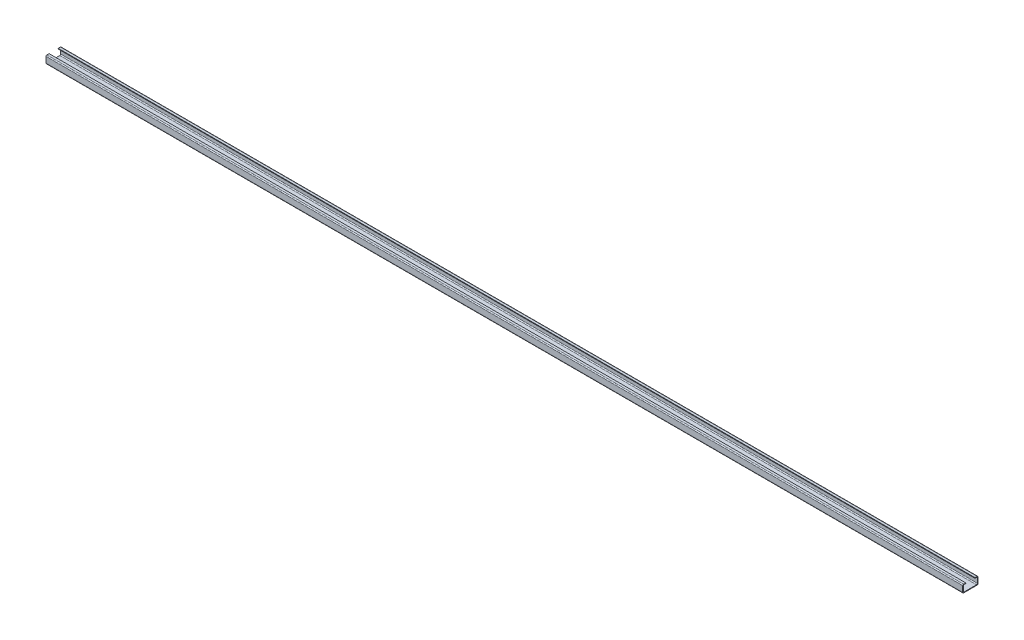
ISO-10303-21;
HEADER;
FILE_DESCRIPTION(('STEP AP214'),'2;1');
FILE_NAME('part.step','',(''),(''),'','','');
FILE_SCHEMA(('AUTOMOTIVE_DESIGN { 1 0 10303 214 1 1 1 1 }'));
ENDSEC;
DATA;
#1=APPLICATION_CONTEXT('core data for automotive mechanical design processes');
#2=APPLICATION_PROTOCOL_DEFINITION('international standard','automotive_design',2000,#1);
#3=PRODUCT_CONTEXT('',#1,'mechanical');
#4=PRODUCT('Part','Part','',(#3));
#5=PRODUCT_RELATED_PRODUCT_CATEGORY('part','',(#4));
#6=PRODUCT_DEFINITION_FORMATION('','',#4);
#7=PRODUCT_DEFINITION_CONTEXT('part definition',#1,'design');
#8=PRODUCT_DEFINITION('design','',#6,#7);
#9=PRODUCT_DEFINITION_SHAPE('','',#8);
#10=(LENGTH_UNIT() NAMED_UNIT(*) SI_UNIT(.MILLI.,.METRE.));
#11=(NAMED_UNIT(*) PLANE_ANGLE_UNIT() SI_UNIT($,.RADIAN.));
#12=(NAMED_UNIT(*) SI_UNIT($,.STERADIAN.) SOLID_ANGLE_UNIT());
#13=UNCERTAINTY_MEASURE_WITH_UNIT(LENGTH_MEASURE(1.E-05),#10,'distance_accuracy_value','');
#14=(GEOMETRIC_REPRESENTATION_CONTEXT(3) GLOBAL_UNCERTAINTY_ASSIGNED_CONTEXT((#13)) GLOBAL_UNIT_ASSIGNED_CONTEXT((#10,
#11,#12)) REPRESENTATION_CONTEXT('',''));
#15=CARTESIAN_POINT('',(0.,0.,0.));
#16=DIRECTION('',(0.,0.,1.));
#17=DIRECTION('',(1.,0.,0.));
#18=AXIS2_PLACEMENT_3D('',#15,#16,#17);
#19=CARTESIAN_POINT('',(6000.,25.,-50.));
#20=DIRECTION('',(0.,0.,1.));
#21=DIRECTION('',(0.,-1.,0.));
#22=AXIS2_PLACEMENT_3D('',#19,#20,#21);
#23=PLANE('',#22);
#24=DIRECTION('',(0.,1.,0.));
#25=VECTOR('',#24,1.);
#26=CARTESIAN_POINT('',(0.,25.,-50.));
#27=LINE('',#26,#25);
#28=CARTESIAN_POINT('',(0.,-19.,-50.));
#29=VERTEX_POINT('',#28);
#30=CARTESIAN_POINT('',(0.,19.,-50.));
#31=VERTEX_POINT('',#30);
#32=EDGE_CURVE('E223',#29,#31,#27,.T.);
#33=ORIENTED_EDGE('',*,*,#32,.T.);
#34=DIRECTION('',(-1.,0.,0.));
#35=VECTOR('',#34,1.);
#36=CARTESIAN_POINT('',(6000.,19.,-50.));
#37=LINE('',#36,#35);
#38=CARTESIAN_POINT('',(6000.,19.,-50.));
#39=VERTEX_POINT('',#38);
#40=EDGE_CURVE('E299',#31,#39,#37,.F.);
#41=ORIENTED_EDGE('',*,*,#40,.T.);
#42=DIRECTION('',(0.,1.,0.));
#43=VECTOR('',#42,1.);
#44=CARTESIAN_POINT('',(6000.,25.,-50.));
#45=LINE('',#44,#43);
#46=CARTESIAN_POINT('',(6000.,-19.,-50.));
#47=VERTEX_POINT('',#46);
#48=EDGE_CURVE('E183',#47,#39,#45,.T.);
#49=ORIENTED_EDGE('',*,*,#48,.F.);
#50=DIRECTION('',(-1.,0.,0.));
#51=VECTOR('',#50,1.);
#52=CARTESIAN_POINT('',(6000.,-19.,-50.));
#53=LINE('',#52,#51);
#54=EDGE_CURVE('E296',#47,#29,#53,.T.);
#55=ORIENTED_EDGE('',*,*,#54,.T.);
#56=EDGE_LOOP('',(#33,#41,#49,#55));
#57=FACE_BOUND('',#56,.T.);
#58=ADVANCED_FACE('F33',(#57),#23,.F.);
#59=CARTESIAN_POINT('',(6000.,25.,-30.));
#60=DIRECTION('',(0.,-1.,0.));
#61=DIRECTION('',(0.,0.,-1.));
#62=AXIS2_PLACEMENT_3D('',#59,#60,#61);
#63=PLANE('',#62);
#64=DIRECTION('',(0.,0.,1.));
#65=VECTOR('',#64,1.);
#66=CARTESIAN_POINT('',(6000.,25.,-30.));
#67=LINE('',#66,#65);
#68=CARTESIAN_POINT('',(6000.,25.,-44.));
#69=VERTEX_POINT('',#68);
#70=CARTESIAN_POINT('',(6000.,25.,-30.));
#71=VERTEX_POINT('',#70);
#72=EDGE_CURVE('E169',#69,#71,#67,.T.);
#73=ORIENTED_EDGE('',*,*,#72,.F.);
#74=DIRECTION('',(-1.,0.,0.));
#75=VECTOR('',#74,1.);
#76=CARTESIAN_POINT('',(6000.,25.,-44.));
#77=LINE('',#76,#75);
#78=CARTESIAN_POINT('',(0.,25.,-44.));
#79=VERTEX_POINT('',#78);
#80=EDGE_CURVE('E294',#69,#79,#77,.T.);
#81=ORIENTED_EDGE('',*,*,#80,.T.);
#82=DIRECTION('',(0.,0.,1.));
#83=VECTOR('',#82,1.);
#84=CARTESIAN_POINT('',(0.,25.,-30.));
#85=LINE('',#84,#83);
#86=CARTESIAN_POINT('',(0.,25.,-30.));
#87=VERTEX_POINT('',#86);
#88=EDGE_CURVE('E189',#79,#87,#85,.T.);
#89=ORIENTED_EDGE('',*,*,#88,.T.);
#90=DIRECTION('',(-1.,0.,0.));
#91=VECTOR('',#90,1.);
#92=CARTESIAN_POINT('',(6000.,25.,-30.));
#93=LINE('',#92,#91);
#94=EDGE_CURVE('E186',#71,#87,#93,.T.);
#95=ORIENTED_EDGE('',*,*,#94,.F.);
#96=EDGE_LOOP('',(#73,#81,#89,#95));
#97=FACE_BOUND('',#96,.T.);
#98=ADVANCED_FACE('F187',(#97),#63,.F.);
#99=CARTESIAN_POINT('',(6000.,25.,-30.));
#100=DIRECTION('',(0.,0.,-1.));
#101=DIRECTION('',(-1.,0.,0.));
#102=AXIS2_PLACEMENT_3D('',#99,#100,#101);
#103=PLANE('',#102);
#104=DIRECTION('',(0.,-1.,0.));
#105=VECTOR('',#104,1.);
#106=CARTESIAN_POINT('',(0.,25.,-30.));
#107=LINE('',#106,#105);
#108=CARTESIAN_POINT('',(0.,21.,-30.));
#109=VERTEX_POINT('',#108);
#110=EDGE_CURVE('E227',#87,#109,#107,.T.);
#111=ORIENTED_EDGE('',*,*,#110,.T.);
#112=DIRECTION('',(-1.,0.,0.));
#113=VECTOR('',#112,1.);
#114=CARTESIAN_POINT('',(6000.,21.,-30.));
#115=LINE('',#114,#113);
#116=CARTESIAN_POINT('',(6000.,21.,-30.));
#117=VERTEX_POINT('',#116);
#118=EDGE_CURVE('E193',#117,#109,#115,.T.);
#119=ORIENTED_EDGE('',*,*,#118,.F.);
#120=DIRECTION('',(0.,-1.,0.));
#121=VECTOR('',#120,1.);
#122=CARTESIAN_POINT('',(6000.,25.,-30.));
#123=LINE('',#122,#121);
#124=EDGE_CURVE('E175',#71,#117,#123,.T.);
#125=ORIENTED_EDGE('',*,*,#124,.F.);
#126=ORIENTED_EDGE('',*,*,#94,.T.);
#127=EDGE_LOOP('',(#111,#119,#125,#126));
#128=FACE_BOUND('',#127,.T.);
#129=ADVANCED_FACE('F195',(#128),#103,.F.);
#130=CARTESIAN_POINT('',(6000.,21.,-30.));
#131=DIRECTION('',(0.,1.,0.));
#132=DIRECTION('',(0.,0.,1.));
#133=AXIS2_PLACEMENT_3D('',#130,#131,#132);
#134=PLANE('',#133);
#135=DIRECTION('',(0.,0.,-1.));
#136=VECTOR('',#135,1.);
#137=CARTESIAN_POINT('',(0.,21.,-30.));
#138=LINE('',#137,#136);
#139=CARTESIAN_POINT('',(0.,21.,-40.));
#140=VERTEX_POINT('',#139);
#141=EDGE_CURVE('E229',#109,#140,#138,.T.);
#142=ORIENTED_EDGE('',*,*,#141,.T.);
#143=DIRECTION('',(-1.,0.,0.));
#144=VECTOR('',#143,1.);
#145=CARTESIAN_POINT('',(6000.,21.,-40.));
#146=LINE('',#145,#144);
#147=CARTESIAN_POINT('',(6000.,21.,-40.));
#148=VERTEX_POINT('',#147);
#149=EDGE_CURVE('E263',#140,#148,#146,.F.);
#150=ORIENTED_EDGE('',*,*,#149,.T.);
#151=DIRECTION('',(0.,0.,-1.));
#152=VECTOR('',#151,1.);
#153=CARTESIAN_POINT('',(6000.,21.,-30.));
#154=LINE('',#153,#152);
#155=EDGE_CURVE('E198',#117,#148,#154,.T.);
#156=ORIENTED_EDGE('',*,*,#155,.F.);
#157=ORIENTED_EDGE('',*,*,#118,.T.);
#158=EDGE_LOOP('',(#142,#150,#156,#157));
#159=FACE_BOUND('',#158,.T.);
#160=ADVANCED_FACE('F458',(#159),#134,.F.);
#161=CARTESIAN_POINT('',(6000.,21.,-46.));
#162=DIRECTION('',(0.,0.,-1.));
#163=DIRECTION('',(0.,1.,0.));
#164=AXIS2_PLACEMENT_3D('',#161,#162,#163);
#165=PLANE('',#164);
#166=DIRECTION('',(0.,-1.,0.));
#167=VECTOR('',#166,1.);
#168=CARTESIAN_POINT('',(6000.,21.,-46.));
#169=LINE('',#168,#167);
#170=CARTESIAN_POINT('',(6000.,15.,-46.));
#171=VERTEX_POINT('',#170);
#172=CARTESIAN_POINT('',(6000.,-15.,-46.));
#173=VERTEX_POINT('',#172);
#174=EDGE_CURVE('E200',#171,#173,#169,.T.);
#175=ORIENTED_EDGE('',*,*,#174,.F.);
#176=DIRECTION('',(-1.,0.,0.));
#177=VECTOR('',#176,1.);
#178=CARTESIAN_POINT('',(0.,15.,-46.));
#179=LINE('',#178,#177);
#180=CARTESIAN_POINT('',(0.,15.,-46.));
#181=VERTEX_POINT('',#180);
#182=EDGE_CURVE('E260',#171,#181,#179,.T.);
#183=ORIENTED_EDGE('',*,*,#182,.T.);
#184=DIRECTION('',(0.,-1.,0.));
#185=VECTOR('',#184,1.);
#186=CARTESIAN_POINT('',(0.,21.,-46.));
#187=LINE('',#186,#185);
#188=CARTESIAN_POINT('',(0.,-15.,-46.));
#189=VERTEX_POINT('',#188);
#190=EDGE_CURVE('E232',#181,#189,#187,.T.);
#191=ORIENTED_EDGE('',*,*,#190,.T.);
#192=DIRECTION('',(-1.,0.,0.));
#193=VECTOR('',#192,1.);
#194=CARTESIAN_POINT('',(6000.,-15.,-46.));
#195=LINE('',#194,#193);
#196=EDGE_CURVE('E192',#189,#173,#195,.F.);
#197=ORIENTED_EDGE('',*,*,#196,.T.);
#198=EDGE_LOOP('',(#175,#183,#191,#197));
#199=FACE_BOUND('',#198,.T.);
#200=ADVANCED_FACE('F453',(#199),#165,.F.);
#201=CARTESIAN_POINT('',(6000.,-21.,46.));
#202=DIRECTION('',(0.,-1.,0.));
#203=DIRECTION('',(0.,0.,-1.));
#204=AXIS2_PLACEMENT_3D('',#201,#202,#203);
#205=PLANE('',#204);
#206=DIRECTION('',(0.,0.,1.));
#207=VECTOR('',#206,1.);
#208=CARTESIAN_POINT('',(6000.,-21.,46.));
#209=LINE('',#208,#207);
#210=CARTESIAN_POINT('',(6000.,-21.,-40.));
#211=VERTEX_POINT('',#210);
#212=CARTESIAN_POINT('',(6000.,-21.,40.));
#213=VERTEX_POINT('',#212);
#214=EDGE_CURVE('E206',#211,#213,#209,.T.);
#215=ORIENTED_EDGE('',*,*,#214,.F.);
#216=DIRECTION('',(-1.,0.,0.));
#217=VECTOR('',#216,1.);
#218=CARTESIAN_POINT('',(0.,-21.,-40.));
#219=LINE('',#218,#217);
#220=CARTESIAN_POINT('',(0.,-21.,-40.));
#221=VERTEX_POINT('',#220);
#222=EDGE_CURVE('E307',#211,#221,#219,.T.);
#223=ORIENTED_EDGE('',*,*,#222,.T.);
#224=DIRECTION('',(0.,0.,1.));
#225=VECTOR('',#224,1.);
#226=CARTESIAN_POINT('',(0.,-21.,46.));
#227=LINE('',#226,#225);
#228=CARTESIAN_POINT('',(0.,-21.,40.));
#229=VERTEX_POINT('',#228);
#230=EDGE_CURVE('E235',#221,#229,#227,.T.);
#231=ORIENTED_EDGE('',*,*,#230,.T.);
#232=DIRECTION('',(-1.,0.,0.));
#233=VECTOR('',#232,1.);
#234=CARTESIAN_POINT('',(6000.,-21.,40.));
#235=LINE('',#234,#233);
#236=EDGE_CURVE('E305',#229,#213,#235,.F.);
#237=ORIENTED_EDGE('',*,*,#236,.T.);
#238=EDGE_LOOP('',(#215,#223,#231,#237));
#239=FACE_BOUND('',#238,.T.);
#240=ADVANCED_FACE('F331',(#239),#205,.F.);
#241=CARTESIAN_POINT('',(6000.,21.,46.));
#242=DIRECTION('',(0.,0.,1.));
#243=DIRECTION('',(0.,-1.,0.));
#244=AXIS2_PLACEMENT_3D('',#241,#242,#243);
#245=PLANE('',#244);
#246=DIRECTION('',(0.,1.,0.));
#247=VECTOR('',#246,1.);
#248=CARTESIAN_POINT('',(0.,21.,46.));
#249=LINE('',#248,#247);
#250=CARTESIAN_POINT('',(0.,-15.,46.));
#251=VERTEX_POINT('',#250);
#252=CARTESIAN_POINT('',(0.,15.,46.));
#253=VERTEX_POINT('',#252);
#254=EDGE_CURVE('E238',#251,#253,#249,.T.);
#255=ORIENTED_EDGE('',*,*,#254,.T.);
#256=DIRECTION('',(-1.,0.,0.));
#257=VECTOR('',#256,1.);
#258=CARTESIAN_POINT('',(6000.,15.,46.));
#259=LINE('',#258,#257);
#260=CARTESIAN_POINT('',(6000.,15.,46.));
#261=VERTEX_POINT('',#260);
#262=EDGE_CURVE('E271',#253,#261,#259,.F.);
#263=ORIENTED_EDGE('',*,*,#262,.T.);
#264=DIRECTION('',(0.,1.,0.));
#265=VECTOR('',#264,1.);
#266=CARTESIAN_POINT('',(6000.,21.,46.));
#267=LINE('',#266,#265);
#268=CARTESIAN_POINT('',(6000.,-15.,46.));
#269=VERTEX_POINT('',#268);
#270=EDGE_CURVE('E209',#269,#261,#267,.T.);
#271=ORIENTED_EDGE('',*,*,#270,.F.);
#272=DIRECTION('',(-1.,0.,0.));
#273=VECTOR('',#272,1.);
#274=CARTESIAN_POINT('',(0.,-15.,46.));
#275=LINE('',#274,#273);
#276=EDGE_CURVE('E268',#269,#251,#275,.T.);
#277=ORIENTED_EDGE('',*,*,#276,.T.);
#278=EDGE_LOOP('',(#255,#263,#271,#277));
#279=FACE_BOUND('',#278,.T.);
#280=ADVANCED_FACE('F338',(#279),#245,.F.);
#281=CARTESIAN_POINT('',(6000.,21.,46.));
#282=DIRECTION('',(0.,1.,0.));
#283=DIRECTION('',(0.,0.,1.));
#284=AXIS2_PLACEMENT_3D('',#281,#282,#283);
#285=PLANE('',#284);
#286=DIRECTION('',(0.,0.,-1.));
#287=VECTOR('',#286,1.);
#288=CARTESIAN_POINT('',(6000.,21.,46.));
#289=LINE('',#288,#287);
#290=CARTESIAN_POINT('',(6000.,21.,40.));
#291=VERTEX_POINT('',#290);
#292=CARTESIAN_POINT('',(6000.,21.,30.));
#293=VERTEX_POINT('',#292);
#294=EDGE_CURVE('E212',#291,#293,#289,.T.);
#295=ORIENTED_EDGE('',*,*,#294,.F.);
#296=DIRECTION('',(-1.,0.,0.));
#297=VECTOR('',#296,1.);
#298=CARTESIAN_POINT('',(0.,21.,40.));
#299=LINE('',#298,#297);
#300=CARTESIAN_POINT('',(0.,21.,40.));
#301=VERTEX_POINT('',#300);
#302=EDGE_CURVE('E265',#291,#301,#299,.T.);
#303=ORIENTED_EDGE('',*,*,#302,.T.);
#304=DIRECTION('',(0.,0.,-1.));
#305=VECTOR('',#304,1.);
#306=CARTESIAN_POINT('',(0.,21.,46.));
#307=LINE('',#306,#305);
#308=CARTESIAN_POINT('',(0.,21.,30.));
#309=VERTEX_POINT('',#308);
#310=EDGE_CURVE('E241',#301,#309,#307,.T.);
#311=ORIENTED_EDGE('',*,*,#310,.T.);
#312=DIRECTION('',(-1.,0.,0.));
#313=VECTOR('',#312,1.);
#314=CARTESIAN_POINT('',(6000.,21.,30.));
#315=LINE('',#314,#313);
#316=EDGE_CURVE('E255',#293,#309,#315,.T.);
#317=ORIENTED_EDGE('',*,*,#316,.F.);
#318=EDGE_LOOP('',(#295,#303,#311,#317));
#319=FACE_BOUND('',#318,.T.);
#320=ADVANCED_FACE('F346',(#319),#285,.F.);
#321=CARTESIAN_POINT('',(6000.,25.,30.));
#322=DIRECTION('',(0.,0.,1.));
#323=DIRECTION('',(1.,0.,0.));
#324=AXIS2_PLACEMENT_3D('',#321,#322,#323);
#325=PLANE('',#324);
#326=DIRECTION('',(0.,1.,0.));
#327=VECTOR('',#326,1.);
#328=CARTESIAN_POINT('',(0.,25.,30.));
#329=LINE('',#328,#327);
#330=CARTESIAN_POINT('',(0.,25.,30.));
#331=VERTEX_POINT('',#330);
#332=EDGE_CURVE('E243',#309,#331,#329,.T.);
#333=ORIENTED_EDGE('',*,*,#332,.T.);
#334=DIRECTION('',(-1.,0.,0.));
#335=VECTOR('',#334,1.);
#336=CARTESIAN_POINT('',(6000.,25.,30.));
#337=LINE('',#336,#335);
#338=CARTESIAN_POINT('',(6000.,25.,30.));
#339=VERTEX_POINT('',#338);
#340=EDGE_CURVE('E222',#339,#331,#337,.T.);
#341=ORIENTED_EDGE('',*,*,#340,.F.);
#342=DIRECTION('',(0.,1.,0.));
#343=VECTOR('',#342,1.);
#344=CARTESIAN_POINT('',(6000.,25.,30.));
#345=LINE('',#344,#343);
#346=EDGE_CURVE('E214',#293,#339,#345,.T.);
#347=ORIENTED_EDGE('',*,*,#346,.F.);
#348=ORIENTED_EDGE('',*,*,#316,.T.);
#349=EDGE_LOOP('',(#333,#341,#347,#348));
#350=FACE_BOUND('',#349,.T.);
#351=ADVANCED_FACE('F352',(#350),#325,.F.);
#352=CARTESIAN_POINT('',(6000.,25.,50.));
#353=DIRECTION('',(0.,-1.,0.));
#354=DIRECTION('',(0.,0.,-1.));
#355=AXIS2_PLACEMENT_3D('',#352,#353,#354);
#356=PLANE('',#355);
#357=DIRECTION('',(0.,0.,1.));
#358=VECTOR('',#357,1.);
#359=CARTESIAN_POINT('',(0.,25.,50.));
#360=LINE('',#359,#358);
#361=CARTESIAN_POINT('',(0.,25.,44.));
#362=VERTEX_POINT('',#361);
#363=EDGE_CURVE('E245',#331,#362,#360,.T.);
#364=ORIENTED_EDGE('',*,*,#363,.T.);
#365=DIRECTION('',(-1.,0.,0.));
#366=VECTOR('',#365,1.);
#367=CARTESIAN_POINT('',(6000.,25.,44.));
#368=LINE('',#367,#366);
#369=CARTESIAN_POINT('',(6000.,25.,44.));
#370=VERTEX_POINT('',#369);
#371=EDGE_CURVE('E286',#362,#370,#368,.F.);
#372=ORIENTED_EDGE('',*,*,#371,.T.);
#373=DIRECTION('',(0.,0.,1.));
#374=VECTOR('',#373,1.);
#375=CARTESIAN_POINT('',(6000.,25.,50.));
#376=LINE('',#375,#374);
#377=EDGE_CURVE('E216',#339,#370,#376,.T.);
#378=ORIENTED_EDGE('',*,*,#377,.F.);
#379=ORIENTED_EDGE('',*,*,#340,.T.);
#380=EDGE_LOOP('',(#364,#372,#378,#379));
#381=FACE_BOUND('',#380,.T.);
#382=ADVANCED_FACE('F475',(#381),#356,.F.);
#383=CARTESIAN_POINT('',(6000.,25.,50.));
#384=DIRECTION('',(0.,0.,-1.));
#385=DIRECTION('',(0.,1.,0.));
#386=AXIS2_PLACEMENT_3D('',#383,#384,#385);
#387=PLANE('',#386);
#388=DIRECTION('',(0.,-1.,0.));
#389=VECTOR('',#388,1.);
#390=CARTESIAN_POINT('',(6000.,25.,50.));
#391=LINE('',#390,#389);
#392=CARTESIAN_POINT('',(6000.,19.,50.));
#393=VERTEX_POINT('',#392);
#394=CARTESIAN_POINT('',(6000.,-19.,50.));
#395=VERTEX_POINT('',#394);
#396=EDGE_CURVE('E218',#393,#395,#391,.T.);
#397=ORIENTED_EDGE('',*,*,#396,.F.);
#398=DIRECTION('',(-1.,0.,0.));
#399=VECTOR('',#398,1.);
#400=CARTESIAN_POINT('',(6000.,19.,50.));
#401=LINE('',#400,#399);
#402=CARTESIAN_POINT('',(0.,19.,50.));
#403=VERTEX_POINT('',#402);
#404=EDGE_CURVE('E275',#393,#403,#401,.T.);
#405=ORIENTED_EDGE('',*,*,#404,.T.);
#406=DIRECTION('',(0.,-1.,0.));
#407=VECTOR('',#406,1.);
#408=CARTESIAN_POINT('',(0.,25.,50.));
#409=LINE('',#408,#407);
#410=CARTESIAN_POINT('',(0.,-19.,50.));
#411=VERTEX_POINT('',#410);
#412=EDGE_CURVE('E248',#403,#411,#409,.T.);
#413=ORIENTED_EDGE('',*,*,#412,.T.);
#414=DIRECTION('',(-1.,0.,0.));
#415=VECTOR('',#414,1.);
#416=CARTESIAN_POINT('',(6000.,-19.,50.));
#417=LINE('',#416,#415);
#418=EDGE_CURVE('E273',#411,#395,#417,.F.);
#419=ORIENTED_EDGE('',*,*,#418,.T.);
#420=EDGE_LOOP('',(#397,#405,#413,#419));
#421=FACE_BOUND('',#420,.T.);
#422=ADVANCED_FACE('F362',(#421),#387,.F.);
#423=CARTESIAN_POINT('',(6000.,-25.,50.));
#424=DIRECTION('',(0.,1.,0.));
#425=DIRECTION('',(0.,0.,1.));
#426=AXIS2_PLACEMENT_3D('',#423,#424,#425);
#427=PLANE('',#426);
#428=DIRECTION('',(0.,0.,-1.));
#429=VECTOR('',#428,1.);
#430=CARTESIAN_POINT('',(0.,-25.,50.));
#431=LINE('',#430,#429);
#432=CARTESIAN_POINT('',(0.,-25.,44.));
#433=VERTEX_POINT('',#432);
#434=CARTESIAN_POINT('',(0.,-25.,-44.));
#435=VERTEX_POINT('',#434);
#436=EDGE_CURVE('E251',#433,#435,#431,.T.);
#437=ORIENTED_EDGE('',*,*,#436,.T.);
#438=DIRECTION('',(-1.,0.,0.));
#439=VECTOR('',#438,1.);
#440=CARTESIAN_POINT('',(6000.,-25.,-44.));
#441=LINE('',#440,#439);
#442=CARTESIAN_POINT('',(6000.,-25.,-44.));
#443=VERTEX_POINT('',#442);
#444=EDGE_CURVE('E48',#435,#443,#441,.F.);
#445=ORIENTED_EDGE('',*,*,#444,.T.);
#446=DIRECTION('',(0.,0.,-1.));
#447=VECTOR('',#446,1.);
#448=CARTESIAN_POINT('',(6000.,-25.,50.));
#449=LINE('',#448,#447);
#450=CARTESIAN_POINT('',(6000.,-25.,44.));
#451=VERTEX_POINT('',#450);
#452=EDGE_CURVE('E220',#451,#443,#449,.T.);
#453=ORIENTED_EDGE('',*,*,#452,.F.);
#454=DIRECTION('',(-1.,0.,0.));
#455=VECTOR('',#454,1.);
#456=CARTESIAN_POINT('',(6000.,-25.,44.));
#457=LINE('',#456,#455);
#458=EDGE_CURVE('E301',#451,#433,#457,.T.);
#459=ORIENTED_EDGE('',*,*,#458,.T.);
#460=EDGE_LOOP('',(#437,#445,#453,#459));
#461=FACE_BOUND('',#460,.T.);
#462=ADVANCED_FACE('F368',(#461),#427,.F.);
#463=CARTESIAN_POINT('',(6000.,0.,0.));
#464=DIRECTION('',(1.,0.,0.));
#465=DIRECTION('',(0.,0.,-1.));
#466=AXIS2_PLACEMENT_3D('',#463,#464,#465);
#467=PLANE('',#466);
#468=ORIENTED_EDGE('',*,*,#377,.T.);
#469=CARTESIAN_POINT('',(6000.,19.,44.));
#470=DIRECTION('',(1.,0.,0.));
#471=DIRECTION('',(0.,0.,-1.));
#472=AXIS2_PLACEMENT_3D('',#469,#470,#471);
#473=CIRCLE('',#472,6.);
#474=EDGE_CURVE('E292',#370,#393,#473,.T.);
#475=ORIENTED_EDGE('',*,*,#474,.T.);
#476=ORIENTED_EDGE('',*,*,#396,.T.);
#477=CARTESIAN_POINT('',(6000.,-19.,44.));
#478=DIRECTION('',(1.,0.,0.));
#479=DIRECTION('',(0.,0.,-1.));
#480=AXIS2_PLACEMENT_3D('',#477,#478,#479);
#481=CIRCLE('',#480,6.);
#482=EDGE_CURVE('E55',#395,#451,#481,.T.);
#483=ORIENTED_EDGE('',*,*,#482,.T.);
#484=ORIENTED_EDGE('',*,*,#452,.T.);
#485=CARTESIAN_POINT('',(6000.,-19.,-44.));
#486=DIRECTION('',(1.,0.,0.));
#487=DIRECTION('',(0.,0.,-1.));
#488=AXIS2_PLACEMENT_3D('',#485,#486,#487);
#489=CIRCLE('',#488,6.);
#490=EDGE_CURVE('E289',#443,#47,#489,.T.);
#491=ORIENTED_EDGE('',*,*,#490,.T.);
#492=ORIENTED_EDGE('',*,*,#48,.T.);
#493=CARTESIAN_POINT('',(6000.,19.,-44.));
#494=DIRECTION('',(1.,0.,0.));
#495=DIRECTION('',(0.,0.,-1.));
#496=AXIS2_PLACEMENT_3D('',#493,#494,#495);
#497=CIRCLE('',#496,6.);
#498=EDGE_CURVE('E179',#39,#69,#497,.T.);
#499=ORIENTED_EDGE('',*,*,#498,.T.);
#500=ORIENTED_EDGE('',*,*,#72,.T.);
#501=ORIENTED_EDGE('',*,*,#124,.T.);
#502=ORIENTED_EDGE('',*,*,#155,.T.);
#503=CARTESIAN_POINT('',(6000.,15.,-40.));
#504=DIRECTION('',(1.,0.,0.));
#505=DIRECTION('',(0.,0.,-1.));
#506=AXIS2_PLACEMENT_3D('',#503,#504,#505);
#507=CIRCLE('',#506,6.);
#508=EDGE_CURVE('E312',#148,#171,#507,.F.);
#509=ORIENTED_EDGE('',*,*,#508,.T.);
#510=ORIENTED_EDGE('',*,*,#174,.T.);
#511=CARTESIAN_POINT('',(6000.,-15.,-40.));
#512=DIRECTION('',(1.,0.,0.));
#513=DIRECTION('',(0.,0.,-1.));
#514=AXIS2_PLACEMENT_3D('',#511,#512,#513);
#515=CIRCLE('',#514,6.);
#516=EDGE_CURVE('E320',#173,#211,#515,.F.);
#517=ORIENTED_EDGE('',*,*,#516,.T.);
#518=ORIENTED_EDGE('',*,*,#214,.T.);
#519=CARTESIAN_POINT('',(6000.,-15.,40.));
#520=DIRECTION('',(1.,0.,0.));
#521=DIRECTION('',(0.,0.,-1.));
#522=AXIS2_PLACEMENT_3D('',#519,#520,#521);
#523=CIRCLE('',#522,6.);
#524=EDGE_CURVE('E11',#213,#269,#523,.F.);
#525=ORIENTED_EDGE('',*,*,#524,.T.);
#526=ORIENTED_EDGE('',*,*,#270,.T.);
#527=CARTESIAN_POINT('',(6000.,15.,40.));
#528=DIRECTION('',(1.,0.,0.));
#529=DIRECTION('',(0.,0.,-1.));
#530=AXIS2_PLACEMENT_3D('',#527,#528,#529);
#531=CIRCLE('',#530,6.);
#532=EDGE_CURVE('E316',#261,#291,#531,.F.);
#533=ORIENTED_EDGE('',*,*,#532,.T.);
#534=ORIENTED_EDGE('',*,*,#294,.T.);
#535=ORIENTED_EDGE('',*,*,#346,.T.);
#536=EDGE_LOOP('',(#468,#475,#476,#483,#484,#491,#492,#499,#500,#501,#502,#509,#510,#517,#518,
#525,#526,#533,#534,#535));
#537=FACE_BOUND('',#536,.T.);
#538=ADVANCED_FACE('F172',(#537),#467,.T.);
#539=CARTESIAN_POINT('',(0.,0.,0.));
#540=DIRECTION('',(1.,0.,0.));
#541=DIRECTION('',(0.,0.,-1.));
#542=AXIS2_PLACEMENT_3D('',#539,#540,#541);
#543=PLANE('',#542);
#544=ORIENTED_EDGE('',*,*,#412,.F.);
#545=CARTESIAN_POINT('',(0.,19.,44.));
#546=DIRECTION('',(1.,0.,0.));
#547=DIRECTION('',(0.,0.,-1.));
#548=AXIS2_PLACEMENT_3D('',#545,#546,#547);
#549=CIRCLE('',#548,6.);
#550=EDGE_CURVE('E284',#403,#362,#549,.F.);
#551=ORIENTED_EDGE('',*,*,#550,.T.);
#552=ORIENTED_EDGE('',*,*,#363,.F.);
#553=ORIENTED_EDGE('',*,*,#332,.F.);
#554=ORIENTED_EDGE('',*,*,#310,.F.);
#555=CARTESIAN_POINT('',(0.,15.,40.));
#556=DIRECTION('',(1.,0.,0.));
#557=DIRECTION('',(0.,0.,-1.));
#558=AXIS2_PLACEMENT_3D('',#555,#556,#557);
#559=CIRCLE('',#558,6.);
#560=EDGE_CURVE('E314',#301,#253,#559,.T.);
#561=ORIENTED_EDGE('',*,*,#560,.T.);
#562=ORIENTED_EDGE('',*,*,#254,.F.);
#563=CARTESIAN_POINT('',(0.,-15.,40.));
#564=DIRECTION('',(1.,0.,0.));
#565=DIRECTION('',(0.,0.,-1.));
#566=AXIS2_PLACEMENT_3D('',#563,#564,#565);
#567=CIRCLE('',#566,6.);
#568=EDGE_CURVE('E41',#251,#229,#567,.T.);
#569=ORIENTED_EDGE('',*,*,#568,.T.);
#570=ORIENTED_EDGE('',*,*,#230,.F.);
#571=CARTESIAN_POINT('',(0.,-15.,-40.));
#572=DIRECTION('',(1.,0.,0.));
#573=DIRECTION('',(0.,0.,-1.));
#574=AXIS2_PLACEMENT_3D('',#571,#572,#573);
#575=CIRCLE('',#574,6.);
#576=EDGE_CURVE('E318',#221,#189,#575,.T.);
#577=ORIENTED_EDGE('',*,*,#576,.T.);
#578=ORIENTED_EDGE('',*,*,#190,.F.);
#579=CARTESIAN_POINT('',(0.,15.,-40.));
#580=DIRECTION('',(1.,0.,0.));
#581=DIRECTION('',(0.,0.,-1.));
#582=AXIS2_PLACEMENT_3D('',#579,#580,#581);
#583=CIRCLE('',#582,6.);
#584=EDGE_CURVE('E310',#181,#140,#583,.T.);
#585=ORIENTED_EDGE('',*,*,#584,.T.);
#586=ORIENTED_EDGE('',*,*,#141,.F.);
#587=ORIENTED_EDGE('',*,*,#110,.F.);
#588=ORIENTED_EDGE('',*,*,#88,.F.);
#589=CARTESIAN_POINT('',(0.,19.,-44.));
#590=DIRECTION('',(1.,0.,0.));
#591=DIRECTION('',(0.,0.,-1.));
#592=AXIS2_PLACEMENT_3D('',#589,#590,#591);
#593=CIRCLE('',#592,6.);
#594=EDGE_CURVE('E282',#79,#31,#593,.F.);
#595=ORIENTED_EDGE('',*,*,#594,.T.);
#596=ORIENTED_EDGE('',*,*,#32,.F.);
#597=CARTESIAN_POINT('',(0.,-19.,-44.));
#598=DIRECTION('',(1.,0.,0.));
#599=DIRECTION('',(0.,0.,-1.));
#600=AXIS2_PLACEMENT_3D('',#597,#598,#599);
#601=CIRCLE('',#600,6.);
#602=EDGE_CURVE('E280',#29,#435,#601,.F.);
#603=ORIENTED_EDGE('',*,*,#602,.T.);
#604=ORIENTED_EDGE('',*,*,#436,.F.);
#605=CARTESIAN_POINT('',(0.,-19.,44.));
#606=DIRECTION('',(1.,0.,0.));
#607=DIRECTION('',(0.,0.,-1.));
#608=AXIS2_PLACEMENT_3D('',#605,#606,#607);
#609=CIRCLE('',#608,6.);
#610=EDGE_CURVE('E278',#433,#411,#609,.F.);
#611=ORIENTED_EDGE('',*,*,#610,.T.);
#612=EDGE_LOOP('',(#544,#551,#552,#553,#554,#561,#562,#569,#570,#577,#578,#585,#586,#587,#588,
#595,#596,#603,#604,#611));
#613=FACE_BOUND('',#612,.T.);
#614=ADVANCED_FACE('F325',(#613),#543,.F.);
#615=CARTESIAN_POINT('',(6000.,15.,-40.));
#616=DIRECTION('',(1.,0.,0.));
#617=DIRECTION('',(0.,0.,-1.));
#618=AXIS2_PLACEMENT_3D('',#615,#616,#617);
#619=CYLINDRICAL_SURFACE('',#618,6.);
#620=ORIENTED_EDGE('',*,*,#508,.F.);
#621=ORIENTED_EDGE('',*,*,#149,.F.);
#622=ORIENTED_EDGE('',*,*,#584,.F.);
#623=ORIENTED_EDGE('',*,*,#182,.F.);
#624=EDGE_LOOP('',(#620,#621,#622,#623));
#625=FACE_BOUND('',#624,.T.);
#626=ADVANCED_FACE('F396',(#625),#619,.F.);
#627=CARTESIAN_POINT('',(6000.,15.,40.));
#628=DIRECTION('',(1.,0.,0.));
#629=DIRECTION('',(0.,0.,-1.));
#630=AXIS2_PLACEMENT_3D('',#627,#628,#629);
#631=CYLINDRICAL_SURFACE('',#630,6.);
#632=ORIENTED_EDGE('',*,*,#532,.F.);
#633=ORIENTED_EDGE('',*,*,#262,.F.);
#634=ORIENTED_EDGE('',*,*,#560,.F.);
#635=ORIENTED_EDGE('',*,*,#302,.F.);
#636=EDGE_LOOP('',(#632,#633,#634,#635));
#637=FACE_BOUND('',#636,.T.);
#638=ADVANCED_FACE('F341',(#637),#631,.F.);
#639=CARTESIAN_POINT('',(6000.,19.,44.));
#640=DIRECTION('',(-1.,0.,0.));
#641=DIRECTION('',(0.,0.,1.));
#642=AXIS2_PLACEMENT_3D('',#639,#640,#641);
#643=CYLINDRICAL_SURFACE('',#642,6.);
#644=ORIENTED_EDGE('',*,*,#474,.F.);
#645=ORIENTED_EDGE('',*,*,#371,.F.);
#646=ORIENTED_EDGE('',*,*,#550,.F.);
#647=ORIENTED_EDGE('',*,*,#404,.F.);
#648=EDGE_LOOP('',(#644,#645,#646,#647));
#649=FACE_BOUND('',#648,.T.);
#650=ADVANCED_FACE('F360',(#649),#643,.T.);
#651=CARTESIAN_POINT('',(6000.,19.,-44.));
#652=DIRECTION('',(-1.,0.,0.));
#653=DIRECTION('',(0.,0.,1.));
#654=AXIS2_PLACEMENT_3D('',#651,#652,#653);
#655=CYLINDRICAL_SURFACE('',#654,6.);
#656=ORIENTED_EDGE('',*,*,#498,.F.);
#657=ORIENTED_EDGE('',*,*,#40,.F.);
#658=ORIENTED_EDGE('',*,*,#594,.F.);
#659=ORIENTED_EDGE('',*,*,#80,.F.);
#660=EDGE_LOOP('',(#656,#657,#658,#659));
#661=FACE_BOUND('',#660,.T.);
#662=ADVANCED_FACE('F378',(#661),#655,.T.);
#663=CARTESIAN_POINT('',(6000.,-19.,-44.));
#664=DIRECTION('',(-1.,0.,0.));
#665=DIRECTION('',(0.,0.,1.));
#666=AXIS2_PLACEMENT_3D('',#663,#664,#665);
#667=CYLINDRICAL_SURFACE('',#666,6.);
#668=ORIENTED_EDGE('',*,*,#490,.F.);
#669=ORIENTED_EDGE('',*,*,#444,.F.);
#670=ORIENTED_EDGE('',*,*,#602,.F.);
#671=ORIENTED_EDGE('',*,*,#54,.F.);
#672=EDGE_LOOP('',(#668,#669,#670,#671));
#673=FACE_BOUND('',#672,.T.);
#674=ADVANCED_FACE('F373',(#673),#667,.T.);
#675=CARTESIAN_POINT('',(6000.,-15.,-40.));
#676=DIRECTION('',(1.,0.,0.));
#677=DIRECTION('',(0.,0.,-1.));
#678=AXIS2_PLACEMENT_3D('',#675,#676,#677);
#679=CYLINDRICAL_SURFACE('',#678,6.);
#680=ORIENTED_EDGE('',*,*,#516,.F.);
#681=ORIENTED_EDGE('',*,*,#196,.F.);
#682=ORIENTED_EDGE('',*,*,#576,.F.);
#683=ORIENTED_EDGE('',*,*,#222,.F.);
#684=EDGE_LOOP('',(#680,#681,#682,#683));
#685=FACE_BOUND('',#684,.T.);
#686=ADVANCED_FACE('F385',(#685),#679,.F.);
#687=CARTESIAN_POINT('',(6000.,-15.,40.));
#688=DIRECTION('',(1.,0.,0.));
#689=DIRECTION('',(0.,0.,-1.));
#690=AXIS2_PLACEMENT_3D('',#687,#688,#689);
#691=CYLINDRICAL_SURFACE('',#690,6.);
#692=ORIENTED_EDGE('',*,*,#524,.F.);
#693=ORIENTED_EDGE('',*,*,#236,.F.);
#694=ORIENTED_EDGE('',*,*,#568,.F.);
#695=ORIENTED_EDGE('',*,*,#276,.F.);
#696=EDGE_LOOP('',(#692,#693,#694,#695));
#697=FACE_BOUND('',#696,.T.);
#698=ADVANCED_FACE('F334',(#697),#691,.F.);
#699=CARTESIAN_POINT('',(6000.,-19.,44.));
#700=DIRECTION('',(-1.,0.,0.));
#701=DIRECTION('',(0.,0.,1.));
#702=AXIS2_PLACEMENT_3D('',#699,#700,#701);
#703=CYLINDRICAL_SURFACE('',#702,6.);
#704=ORIENTED_EDGE('',*,*,#482,.F.);
#705=ORIENTED_EDGE('',*,*,#418,.F.);
#706=ORIENTED_EDGE('',*,*,#610,.F.);
#707=ORIENTED_EDGE('',*,*,#458,.F.);
#708=EDGE_LOOP('',(#704,#705,#706,#707));
#709=FACE_BOUND('',#708,.T.);
#710=ADVANCED_FACE('F35',(#709),#703,.T.);
#711=CLOSED_SHELL('',(#58,#98,#129,#160,#200,#240,#280,#320,#351,#382,#422,#462,#538,#614,#626,
#638,#650,#662,#674,#686,#698,#710));
#712=MANIFOLD_SOLID_BREP('B2',#711);
#713=ADVANCED_BREP_SHAPE_REPRESENTATION('',(#18,#712),#14);
#714=SHAPE_DEFINITION_REPRESENTATION(#9,#713);
ENDSEC;
END-ISO-10303-21;
